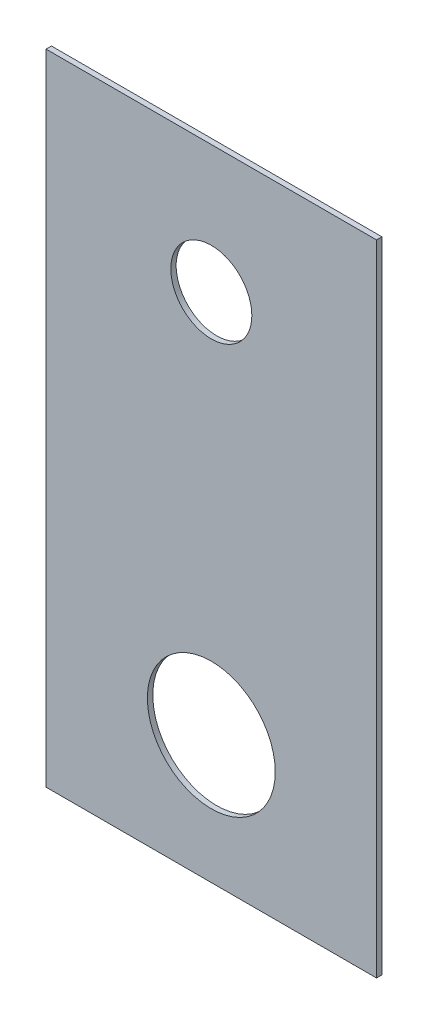
ISO-10303-21;
HEADER;
FILE_DESCRIPTION(('STEP AP214'),'2;1');
FILE_NAME('part.step','',(''),(''),'','','');
FILE_SCHEMA(('AUTOMOTIVE_DESIGN { 1 0 10303 214 1 1 1 1 }'));
ENDSEC;
DATA;
#1=APPLICATION_CONTEXT('core data for automotive mechanical design processes');
#2=APPLICATION_PROTOCOL_DEFINITION('international standard','automotive_design',2000,#1);
#3=PRODUCT_CONTEXT('',#1,'mechanical');
#4=PRODUCT('Part','Part','',(#3));
#5=PRODUCT_RELATED_PRODUCT_CATEGORY('part','',(#4));
#6=PRODUCT_DEFINITION_FORMATION('','',#4);
#7=PRODUCT_DEFINITION_CONTEXT('part definition',#1,'design');
#8=PRODUCT_DEFINITION('design','',#6,#7);
#9=PRODUCT_DEFINITION_SHAPE('','',#8);
#10=(LENGTH_UNIT() NAMED_UNIT(*) SI_UNIT(.MILLI.,.METRE.));
#11=(NAMED_UNIT(*) PLANE_ANGLE_UNIT() SI_UNIT($,.RADIAN.));
#12=(NAMED_UNIT(*) SI_UNIT($,.STERADIAN.) SOLID_ANGLE_UNIT());
#13=UNCERTAINTY_MEASURE_WITH_UNIT(LENGTH_MEASURE(1.E-05),#10,'distance_accuracy_value','');
#14=(GEOMETRIC_REPRESENTATION_CONTEXT(3) GLOBAL_UNCERTAINTY_ASSIGNED_CONTEXT((#13)) GLOBAL_UNIT_ASSIGNED_CONTEXT((#10,
#11,#12)) REPRESENTATION_CONTEXT('',''));
#15=CARTESIAN_POINT('',(0.,0.,0.));
#16=DIRECTION('',(0.,0.,1.));
#17=DIRECTION('',(1.,0.,0.));
#18=AXIS2_PLACEMENT_3D('',#15,#16,#17);
#19=CARTESIAN_POINT('',(0.,0.,1.06834910620399));
#20=DIRECTION('',(0.,0.,-1.));
#21=DIRECTION('',(-1.,0.,0.));
#22=AXIS2_PLACEMENT_3D('',#19,#20,#21);
#23=PLANE('',#22);
#24=DIRECTION('',(0.,-1.,0.));
#25=VECTOR('',#24,1.);
#26=CARTESIAN_POINT('',(0.,0.,1.06834910620399));
#27=LINE('',#26,#25);
#28=CARTESIAN_POINT('',(0.,127.,1.06834910620399));
#29=VERTEX_POINT('',#28);
#30=CARTESIAN_POINT('',(0.,0.,1.06834910620399));
#31=VERTEX_POINT('',#30);
#32=EDGE_CURVE('E657',#29,#31,#27,.T.);
#33=ORIENTED_EDGE('',*,*,#32,.T.);
#34=DIRECTION('',(1.,0.,0.));
#35=VECTOR('',#34,1.);
#36=CARTESIAN_POINT('',(0.,0.,1.06834910620399));
#37=LINE('',#36,#35);
#38=CARTESIAN_POINT('',(65.659,0.,1.06834910620399));
#39=VERTEX_POINT('',#38);
#40=EDGE_CURVE('E652',#31,#39,#37,.T.);
#41=ORIENTED_EDGE('',*,*,#40,.T.);
#42=DIRECTION('',(0.,1.,0.));
#43=VECTOR('',#42,1.);
#44=CARTESIAN_POINT('',(65.659,0.,1.06834910620399));
#45=LINE('',#44,#43);
#46=CARTESIAN_POINT('',(65.659,127.,1.06834910620399));
#47=VERTEX_POINT('',#46);
#48=EDGE_CURVE('E654',#39,#47,#45,.T.);
#49=ORIENTED_EDGE('',*,*,#48,.T.);
#50=DIRECTION('',(-1.,0.,0.));
#51=VECTOR('',#50,1.);
#52=CARTESIAN_POINT('',(0.,127.,1.06834910620399));
#53=LINE('',#52,#51);
#54=EDGE_CURVE('E623',#47,#29,#53,.T.);
#55=ORIENTED_EDGE('',*,*,#54,.T.);
#56=EDGE_LOOP('',(#33,#41,#49,#55));
#57=FACE_BOUND('',#56,.T.);
#58=CARTESIAN_POINT('',(32.8295,101.6,1.06834910620399));
#59=DIRECTION('',(0.,0.,1.));
#60=DIRECTION('',(1.,0.,0.));
#61=AXIS2_PLACEMENT_3D('',#58,#59,#60);
#62=CIRCLE('',#61,8.0518);
#63=CARTESIAN_POINT('',(40.8813,101.6,1.06834910620399));
#64=VERTEX_POINT('',#63);
#65=EDGE_CURVE('E680',#64,#64,#62,.T.);
#66=ORIENTED_EDGE('',*,*,#65,.F.);
#67=EDGE_LOOP('',(#66));
#68=FACE_BOUND('',#67,.T.);
#69=CARTESIAN_POINT('',(32.8295,25.4,1.06834910620399));
#70=DIRECTION('',(0.,0.,1.));
#71=DIRECTION('',(1.,0.,0.));
#72=AXIS2_PLACEMENT_3D('',#69,#70,#71);
#73=CIRCLE('',#72,12.7);
#74=CARTESIAN_POINT('',(45.5295,25.4,1.06834910620399));
#75=VERTEX_POINT('',#74);
#76=EDGE_CURVE('E702',#75,#75,#73,.T.);
#77=ORIENTED_EDGE('',*,*,#76,.F.);
#78=EDGE_LOOP('',(#77));
#79=FACE_BOUND('',#78,.T.);
#80=ADVANCED_FACE('F605',(#57,#68,#79),#23,.F.);
#81=CARTESIAN_POINT('',(0.,0.,0.));
#82=DIRECTION('',(0.,0.,-1.));
#83=DIRECTION('',(-1.,0.,0.));
#84=AXIS2_PLACEMENT_3D('',#81,#82,#83);
#85=PLANE('',#84);
#86=CARTESIAN_POINT('',(32.8295,101.6,0.));
#87=DIRECTION('',(0.,0.,1.));
#88=DIRECTION('',(1.,0.,0.));
#89=AXIS2_PLACEMENT_3D('',#86,#87,#88);
#90=CIRCLE('',#89,8.0518);
#91=CARTESIAN_POINT('',(40.8813,101.6,0.));
#92=VERTEX_POINT('',#91);
#93=EDGE_CURVE('E700',#92,#92,#90,.T.);
#94=ORIENTED_EDGE('',*,*,#93,.T.);
#95=EDGE_LOOP('',(#94));
#96=FACE_BOUND('',#95,.T.);
#97=DIRECTION('',(0.,-1.,0.));
#98=VECTOR('',#97,1.);
#99=CARTESIAN_POINT('',(0.,0.,0.));
#100=LINE('',#99,#98);
#101=CARTESIAN_POINT('',(0.,127.,0.));
#102=VERTEX_POINT('',#101);
#103=CARTESIAN_POINT('',(0.,0.,0.));
#104=VERTEX_POINT('',#103);
#105=EDGE_CURVE('E673',#102,#104,#100,.T.);
#106=ORIENTED_EDGE('',*,*,#105,.F.);
#107=DIRECTION('',(-1.,0.,0.));
#108=VECTOR('',#107,1.);
#109=CARTESIAN_POINT('',(0.,127.,0.));
#110=LINE('',#109,#108);
#111=CARTESIAN_POINT('',(65.659,127.,0.));
#112=VERTEX_POINT('',#111);
#113=EDGE_CURVE('E641',#112,#102,#110,.T.);
#114=ORIENTED_EDGE('',*,*,#113,.F.);
#115=DIRECTION('',(0.,1.,0.));
#116=VECTOR('',#115,1.);
#117=CARTESIAN_POINT('',(65.659,0.,0.));
#118=LINE('',#117,#116);
#119=CARTESIAN_POINT('',(65.659,0.,0.));
#120=VERTEX_POINT('',#119);
#121=EDGE_CURVE('E637',#120,#112,#118,.T.);
#122=ORIENTED_EDGE('',*,*,#121,.F.);
#123=DIRECTION('',(1.,0.,0.));
#124=VECTOR('',#123,1.);
#125=CARTESIAN_POINT('',(0.,0.,0.));
#126=LINE('',#125,#124);
#127=EDGE_CURVE('E663',#104,#120,#126,.T.);
#128=ORIENTED_EDGE('',*,*,#127,.F.);
#129=EDGE_LOOP('',(#106,#114,#122,#128));
#130=FACE_BOUND('',#129,.T.);
#131=CARTESIAN_POINT('',(32.8295,25.4,0.));
#132=DIRECTION('',(0.,0.,1.));
#133=DIRECTION('',(1.,0.,0.));
#134=AXIS2_PLACEMENT_3D('',#131,#132,#133);
#135=CIRCLE('',#134,12.7);
#136=CARTESIAN_POINT('',(45.5295,25.4,0.));
#137=VERTEX_POINT('',#136);
#138=EDGE_CURVE('E703',#137,#137,#135,.T.);
#139=ORIENTED_EDGE('',*,*,#138,.T.);
#140=EDGE_LOOP('',(#139));
#141=FACE_BOUND('',#140,.T.);
#142=ADVANCED_FACE('F692',(#96,#130,#141),#85,.T.);
#143=CARTESIAN_POINT('',(0.,0.,1.06834910620399));
#144=DIRECTION('',(1.,0.,0.));
#145=DIRECTION('',(0.,0.,-1.));
#146=AXIS2_PLACEMENT_3D('',#143,#144,#145);
#147=PLANE('',#146);
#148=ORIENTED_EDGE('',*,*,#105,.T.);
#149=DIRECTION('',(0.,0.,-1.));
#150=VECTOR('',#149,1.);
#151=CARTESIAN_POINT('',(0.,0.,1.06834910620399));
#152=LINE('',#151,#150);
#153=EDGE_CURVE('E12',#31,#104,#152,.T.);
#154=ORIENTED_EDGE('',*,*,#153,.F.);
#155=ORIENTED_EDGE('',*,*,#32,.F.);
#156=DIRECTION('',(0.,0.,-1.));
#157=VECTOR('',#156,1.);
#158=CARTESIAN_POINT('',(0.,127.,1.06834910620399));
#159=LINE('',#158,#157);
#160=EDGE_CURVE('E669',#29,#102,#159,.T.);
#161=ORIENTED_EDGE('',*,*,#160,.T.);
#162=EDGE_LOOP('',(#148,#154,#155,#161));
#163=FACE_BOUND('',#162,.T.);
#164=ADVANCED_FACE('F603',(#163),#147,.F.);
#165=CARTESIAN_POINT('',(0.,0.,1.06834910620399));
#166=DIRECTION('',(0.,1.,0.));
#167=DIRECTION('',(0.,0.,1.));
#168=AXIS2_PLACEMENT_3D('',#165,#166,#167);
#169=PLANE('',#168);
#170=ORIENTED_EDGE('',*,*,#127,.T.);
#171=DIRECTION('',(0.,0.,-1.));
#172=VECTOR('',#171,1.);
#173=CARTESIAN_POINT('',(65.659,0.,1.06834910620399));
#174=LINE('',#173,#172);
#175=EDGE_CURVE('E615',#39,#120,#174,.T.);
#176=ORIENTED_EDGE('',*,*,#175,.F.);
#177=ORIENTED_EDGE('',*,*,#40,.F.);
#178=ORIENTED_EDGE('',*,*,#153,.T.);
#179=EDGE_LOOP('',(#170,#176,#177,#178));
#180=FACE_BOUND('',#179,.T.);
#181=ADVANCED_FACE('F658',(#180),#169,.F.);
#182=CARTESIAN_POINT('',(65.659,0.,1.06834910620399));
#183=DIRECTION('',(-1.,0.,0.));
#184=DIRECTION('',(0.,0.,1.));
#185=AXIS2_PLACEMENT_3D('',#182,#183,#184);
#186=PLANE('',#185);
#187=ORIENTED_EDGE('',*,*,#121,.T.);
#188=DIRECTION('',(0.,0.,-1.));
#189=VECTOR('',#188,1.);
#190=CARTESIAN_POINT('',(65.659,127.,1.06834910620399));
#191=LINE('',#190,#189);
#192=EDGE_CURVE('E661',#47,#112,#191,.T.);
#193=ORIENTED_EDGE('',*,*,#192,.F.);
#194=ORIENTED_EDGE('',*,*,#48,.F.);
#195=ORIENTED_EDGE('',*,*,#175,.T.);
#196=EDGE_LOOP('',(#187,#193,#194,#195));
#197=FACE_BOUND('',#196,.T.);
#198=ADVANCED_FACE('F665',(#197),#186,.F.);
#199=CARTESIAN_POINT('',(0.,127.,1.06834910620399));
#200=DIRECTION('',(0.,-1.,0.));
#201=DIRECTION('',(0.,0.,-1.));
#202=AXIS2_PLACEMENT_3D('',#199,#200,#201);
#203=PLANE('',#202);
#204=ORIENTED_EDGE('',*,*,#113,.T.);
#205=ORIENTED_EDGE('',*,*,#160,.F.);
#206=ORIENTED_EDGE('',*,*,#54,.F.);
#207=ORIENTED_EDGE('',*,*,#192,.T.);
#208=EDGE_LOOP('',(#204,#205,#206,#207));
#209=FACE_BOUND('',#208,.T.);
#210=ADVANCED_FACE('F689',(#209),#203,.F.);
#211=CARTESIAN_POINT('',(32.8295,101.6,1.06834910620399));
#212=DIRECTION('',(0.,0.,-1.));
#213=DIRECTION('',(-1.,0.,0.));
#214=AXIS2_PLACEMENT_3D('',#211,#212,#213);
#215=CYLINDRICAL_SURFACE('',#214,8.0518);
#216=ORIENTED_EDGE('',*,*,#65,.T.);
#217=EDGE_LOOP('',(#216));
#218=FACE_BOUND('',#217,.T.);
#219=ORIENTED_EDGE('',*,*,#93,.F.);
#220=EDGE_LOOP('',(#219));
#221=FACE_BOUND('',#220,.T.);
#222=ADVANCED_FACE('F724',(#218,#221),#215,.F.);
#223=CARTESIAN_POINT('',(32.8295,25.4,1.06834910620399));
#224=DIRECTION('',(0.,0.,-1.));
#225=DIRECTION('',(-1.,0.,0.));
#226=AXIS2_PLACEMENT_3D('',#223,#224,#225);
#227=CYLINDRICAL_SURFACE('',#226,12.7);
#228=ORIENTED_EDGE('',*,*,#76,.T.);
#229=EDGE_LOOP('',(#228));
#230=FACE_BOUND('',#229,.T.);
#231=ORIENTED_EDGE('',*,*,#138,.F.);
#232=EDGE_LOOP('',(#231));
#233=FACE_BOUND('',#232,.T.);
#234=ADVANCED_FACE('F714',(#230,#233),#227,.F.);
#235=CLOSED_SHELL('',(#80,#142,#164,#181,#198,#210,#222,#234));
#236=MANIFOLD_SOLID_BREP('B2',#235);
#237=ADVANCED_BREP_SHAPE_REPRESENTATION('',(#18,#236),#14);
#238=SHAPE_DEFINITION_REPRESENTATION(#9,#237);
ENDSEC;
END-ISO-10303-21;
